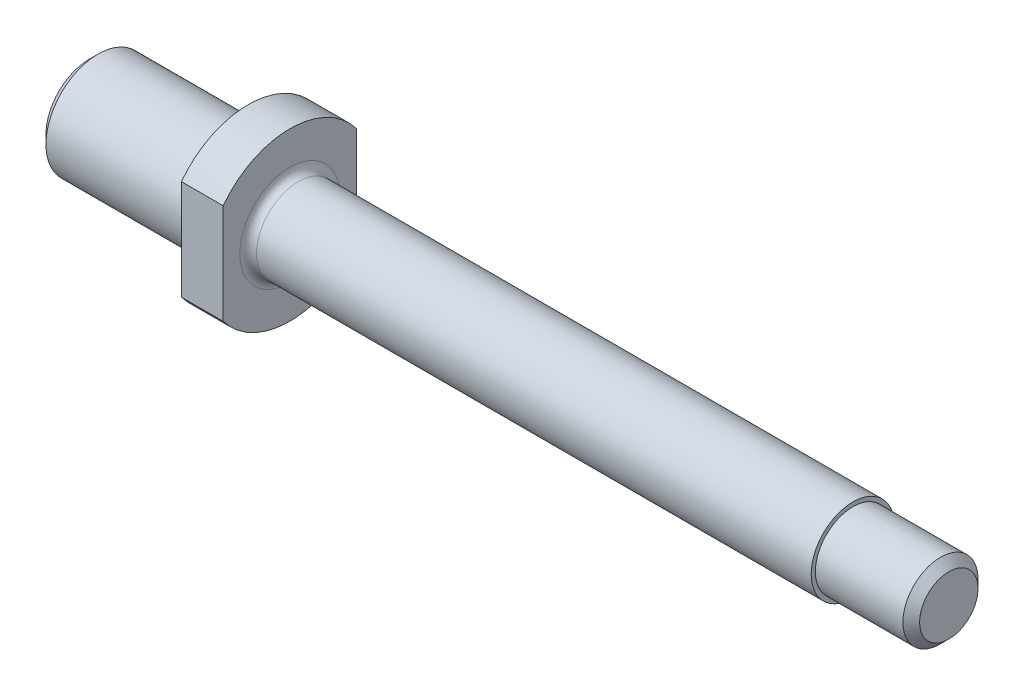
ISO-10303-21;
HEADER;
FILE_DESCRIPTION(('STEP AP214'),'2;1');
FILE_NAME('part.step','',(''),(''),'','','');
FILE_SCHEMA(('AUTOMOTIVE_DESIGN { 1 0 10303 214 1 1 1 1 }'));
ENDSEC;
DATA;
#1=APPLICATION_CONTEXT('core data for automotive mechanical design processes');
#2=APPLICATION_PROTOCOL_DEFINITION('international standard','automotive_design',2000,#1);
#3=PRODUCT_CONTEXT('',#1,'mechanical');
#4=PRODUCT('Part','Part','',(#3));
#5=PRODUCT_RELATED_PRODUCT_CATEGORY('part','',(#4));
#6=PRODUCT_DEFINITION_FORMATION('','',#4);
#7=PRODUCT_DEFINITION_CONTEXT('part definition',#1,'design');
#8=PRODUCT_DEFINITION('design','',#6,#7);
#9=PRODUCT_DEFINITION_SHAPE('','',#8);
#10=(LENGTH_UNIT() NAMED_UNIT(*) SI_UNIT(.MILLI.,.METRE.));
#11=(NAMED_UNIT(*) PLANE_ANGLE_UNIT() SI_UNIT($,.RADIAN.));
#12=(NAMED_UNIT(*) SI_UNIT($,.STERADIAN.) SOLID_ANGLE_UNIT());
#13=UNCERTAINTY_MEASURE_WITH_UNIT(LENGTH_MEASURE(1.E-05),#10,'distance_accuracy_value','');
#14=(GEOMETRIC_REPRESENTATION_CONTEXT(3) GLOBAL_UNCERTAINTY_ASSIGNED_CONTEXT((#13)) GLOBAL_UNIT_ASSIGNED_CONTEXT((#10,
#11,#12)) REPRESENTATION_CONTEXT('',''));
#15=CARTESIAN_POINT('',(0.,0.,0.));
#16=DIRECTION('',(0.,0.,1.));
#17=DIRECTION('',(1.,0.,0.));
#18=AXIS2_PLACEMENT_3D('',#15,#16,#17);
#19=CARTESIAN_POINT('',(0.,0.,0.));
#20=DIRECTION('',(-1.,0.,0.));
#21=DIRECTION('',(0.,0.,1.));
#22=AXIS2_PLACEMENT_3D('',#19,#20,#21);
#23=CYLINDRICAL_SURFACE('',#22,2.);
#24=CARTESIAN_POINT('',(4.8,0.,0.));
#25=DIRECTION('',(-1.,0.,0.));
#26=DIRECTION('',(0.,0.,1.));
#27=AXIS2_PLACEMENT_3D('',#24,#25,#26);
#28=CIRCLE('',#27,2.);
#29=CARTESIAN_POINT('',(4.8,1.2,1.6));
#30=VERTEX_POINT('',#29);
#31=CARTESIAN_POINT('',(4.8,1.2,-1.6));
#32=VERTEX_POINT('',#31);
#33=EDGE_CURVE('E72',#30,#32,#28,.T.);
#34=ORIENTED_EDGE('',*,*,#33,.T.);
#35=DIRECTION('',(1.,0.,0.));
#36=VECTOR('',#35,1.);
#37=CARTESIAN_POINT('',(0.,1.2,-1.6));
#38=LINE('',#37,#36);
#39=CARTESIAN_POINT('',(3.8,1.2,-1.6));
#40=VERTEX_POINT('',#39);
#41=EDGE_CURVE('E31',#40,#32,#38,.T.);
#42=ORIENTED_EDGE('',*,*,#41,.F.);
#43=CARTESIAN_POINT('',(3.8,0.,0.));
#44=DIRECTION('',(-1.,0.,0.));
#45=DIRECTION('',(0.,0.,1.));
#46=AXIS2_PLACEMENT_3D('',#43,#44,#45);
#47=CIRCLE('',#46,2.);
#48=CARTESIAN_POINT('',(3.8,1.2,1.6));
#49=VERTEX_POINT('',#48);
#50=EDGE_CURVE('E80',#49,#40,#47,.T.);
#51=ORIENTED_EDGE('',*,*,#50,.F.);
#52=DIRECTION('',(1.,0.,0.));
#53=VECTOR('',#52,1.);
#54=CARTESIAN_POINT('',(0.,1.2,1.6));
#55=LINE('',#54,#53);
#56=EDGE_CURVE('E173',#49,#30,#55,.T.);
#57=ORIENTED_EDGE('',*,*,#56,.T.);
#58=EDGE_LOOP('',(#34,#42,#51,#57));
#59=FACE_BOUND('',#58,.T.);
#60=ADVANCED_FACE('F16',(#59),#23,.T.);
#61=CARTESIAN_POINT('',(0.,0.,0.));
#62=DIRECTION('',(1.,0.,0.));
#63=DIRECTION('',(0.,0.,-1.));
#64=AXIS2_PLACEMENT_3D('',#61,#62,#63);
#65=PLANE('',#64);
#66=CARTESIAN_POINT('',(0.,0.,0.));
#67=DIRECTION('',(1.,0.,0.));
#68=DIRECTION('',(0.,0.,-1.));
#69=AXIS2_PLACEMENT_3D('',#66,#67,#68);
#70=CIRCLE('',#69,1.05);
#71=CARTESIAN_POINT('',(0.,0.,-1.05));
#72=VERTEX_POINT('',#71);
#73=EDGE_CURVE('E95',#72,#72,#70,.F.);
#74=ORIENTED_EDGE('',*,*,#73,.T.);
#75=EDGE_LOOP('',(#74));
#76=FACE_BOUND('',#75,.T.);
#77=ADVANCED_FACE('F118',(#76),#65,.F.);
#78=CARTESIAN_POINT('',(0.,0.,0.));
#79=DIRECTION('',(-1.,0.,0.));
#80=DIRECTION('',(0.,0.,1.));
#81=AXIS2_PLACEMENT_3D('',#78,#79,#80);
#82=CYLINDRICAL_SURFACE('',#81,1.25);
#83=CARTESIAN_POINT('',(3.6,0.,0.));
#84=DIRECTION('',(1.,0.,0.));
#85=DIRECTION('',(0.,0.,-1.));
#86=AXIS2_PLACEMENT_3D('',#83,#84,#85);
#87=CIRCLE('',#86,1.25);
#88=CARTESIAN_POINT('',(3.6,0.,-1.25));
#89=VERTEX_POINT('',#88);
#90=EDGE_CURVE('E24',#89,#89,#87,.F.);
#91=ORIENTED_EDGE('',*,*,#90,.T.);
#92=EDGE_LOOP('',(#91));
#93=FACE_BOUND('',#92,.T.);
#94=CARTESIAN_POINT('',(0.2,0.,0.));
#95=DIRECTION('',(1.,0.,0.));
#96=DIRECTION('',(0.,0.,-1.));
#97=AXIS2_PLACEMENT_3D('',#94,#95,#96);
#98=CIRCLE('',#97,1.25);
#99=CARTESIAN_POINT('',(0.2,0.,-1.25));
#100=VERTEX_POINT('',#99);
#101=EDGE_CURVE('E98',#100,#100,#98,.T.);
#102=ORIENTED_EDGE('',*,*,#101,.T.);
#103=EDGE_LOOP('',(#102));
#104=FACE_BOUND('',#103,.T.);
#105=ADVANCED_FACE('F103',(#93,#104),#82,.T.);
#106=CARTESIAN_POINT('',(3.8,1.25,0.));
#107=DIRECTION('',(1.,0.,0.));
#108=DIRECTION('',(0.,0.,-1.));
#109=AXIS2_PLACEMENT_3D('',#106,#107,#108);
#110=PLANE('',#109);
#111=CARTESIAN_POINT('',(3.8,0.,0.));
#112=DIRECTION('',(1.,0.,0.));
#113=DIRECTION('',(0.,0.,-1.));
#114=AXIS2_PLACEMENT_3D('',#111,#112,#113);
#115=CIRCLE('',#114,1.45);
#116=CARTESIAN_POINT('',(3.8,0.,-1.45));
#117=VERTEX_POINT('',#116);
#118=EDGE_CURVE('E11',#117,#117,#115,.T.);
#119=ORIENTED_EDGE('',*,*,#118,.T.);
#120=EDGE_LOOP('',(#119));
#121=FACE_BOUND('',#120,.T.);
#122=ORIENTED_EDGE('',*,*,#50,.T.);
#123=DIRECTION('',(0.,-1.,0.));
#124=VECTOR('',#123,1.);
#125=CARTESIAN_POINT('',(3.8,1.25,-1.6));
#126=LINE('',#125,#124);
#127=CARTESIAN_POINT('',(3.8,-1.2,-1.6));
#128=VERTEX_POINT('',#127);
#129=EDGE_CURVE('E67',#40,#128,#126,.T.);
#130=ORIENTED_EDGE('',*,*,#129,.T.);
#131=CARTESIAN_POINT('',(3.8,-1.2,1.6));
#132=VERTEX_POINT('',#131);
#133=EDGE_CURVE('E66',#128,#132,#47,.T.);
#134=ORIENTED_EDGE('',*,*,#133,.T.);
#135=DIRECTION('',(0.,1.,0.));
#136=VECTOR('',#135,1.);
#137=CARTESIAN_POINT('',(3.8,1.25,1.6));
#138=LINE('',#137,#136);
#139=EDGE_CURVE('E171',#132,#49,#138,.T.);
#140=ORIENTED_EDGE('',*,*,#139,.T.);
#141=EDGE_LOOP('',(#122,#130,#134,#140));
#142=FACE_BOUND('',#141,.T.);
#143=ADVANCED_FACE('F130',(#121,#142),#110,.F.);
#144=ORIENTED_EDGE('',*,*,#133,.F.);
#145=DIRECTION('',(1.,0.,0.));
#146=VECTOR('',#145,1.);
#147=CARTESIAN_POINT('',(0.,-1.2,-1.6));
#148=LINE('',#147,#146);
#149=CARTESIAN_POINT('',(4.8,-1.2,-1.6));
#150=VERTEX_POINT('',#149);
#151=EDGE_CURVE('E58',#128,#150,#148,.T.);
#152=ORIENTED_EDGE('',*,*,#151,.T.);
#153=CARTESIAN_POINT('',(4.8,-1.2,1.6));
#154=VERTEX_POINT('',#153);
#155=EDGE_CURVE('E39',#150,#154,#28,.T.);
#156=ORIENTED_EDGE('',*,*,#155,.T.);
#157=DIRECTION('',(1.,0.,0.));
#158=VECTOR('',#157,1.);
#159=CARTESIAN_POINT('',(0.,-1.2,1.6));
#160=LINE('',#159,#158);
#161=EDGE_CURVE('E176',#132,#154,#160,.T.);
#162=ORIENTED_EDGE('',*,*,#161,.F.);
#163=EDGE_LOOP('',(#144,#152,#156,#162));
#164=FACE_BOUND('',#163,.T.);
#165=ADVANCED_FACE('F65',(#164),#23,.T.);
#166=CARTESIAN_POINT('',(4.8,1.,0.));
#167=DIRECTION('',(-1.,0.,0.));
#168=DIRECTION('',(0.,0.,1.));
#169=AXIS2_PLACEMENT_3D('',#166,#167,#168);
#170=PLANE('',#169);
#171=CARTESIAN_POINT('',(4.8,0.,0.));
#172=DIRECTION('',(-1.,0.,0.));
#173=DIRECTION('',(0.,0.,1.));
#174=AXIS2_PLACEMENT_3D('',#171,#172,#173);
#175=CIRCLE('',#174,1.2);
#176=CARTESIAN_POINT('',(4.8,0.,1.2));
#177=VERTEX_POINT('',#176);
#178=EDGE_CURVE('E83',#177,#177,#175,.T.);
#179=ORIENTED_EDGE('',*,*,#178,.T.);
#180=EDGE_LOOP('',(#179));
#181=FACE_BOUND('',#180,.T.);
#182=ORIENTED_EDGE('',*,*,#155,.F.);
#183=DIRECTION('',(0.,-1.,0.));
#184=VECTOR('',#183,1.);
#185=CARTESIAN_POINT('',(4.8,-1.2,-1.6));
#186=LINE('',#185,#184);
#187=EDGE_CURVE('E56',#32,#150,#186,.T.);
#188=ORIENTED_EDGE('',*,*,#187,.F.);
#189=ORIENTED_EDGE('',*,*,#33,.F.);
#190=DIRECTION('',(0.,1.,0.));
#191=VECTOR('',#190,1.);
#192=CARTESIAN_POINT('',(4.8,1.2,1.6));
#193=LINE('',#192,#191);
#194=EDGE_CURVE('E71',#154,#30,#193,.T.);
#195=ORIENTED_EDGE('',*,*,#194,.F.);
#196=EDGE_LOOP('',(#182,#188,#189,#195));
#197=FACE_BOUND('',#196,.T.);
#198=ADVANCED_FACE('F70',(#181,#197),#170,.F.);
#199=CARTESIAN_POINT('',(0.,0.,0.));
#200=DIRECTION('',(-1.,0.,0.));
#201=DIRECTION('',(0.,0.,1.));
#202=AXIS2_PLACEMENT_3D('',#199,#200,#201);
#203=CYLINDRICAL_SURFACE('',#202,1.);
#204=CARTESIAN_POINT('',(5.,0.,0.));
#205=DIRECTION('',(-1.,0.,0.));
#206=DIRECTION('',(0.,0.,1.));
#207=AXIS2_PLACEMENT_3D('',#204,#205,#206);
#208=CIRCLE('',#207,1.);
#209=CARTESIAN_POINT('',(5.,0.,1.));
#210=VERTEX_POINT('',#209);
#211=EDGE_CURVE('E86',#210,#210,#208,.F.);
#212=ORIENTED_EDGE('',*,*,#211,.T.);
#213=EDGE_LOOP('',(#212));
#214=FACE_BOUND('',#213,.T.);
#215=CARTESIAN_POINT('',(18.3,0.,0.));
#216=DIRECTION('',(-1.,0.,0.));
#217=DIRECTION('',(0.,0.,1.));
#218=AXIS2_PLACEMENT_3D('',#215,#216,#217);
#219=CIRCLE('',#218,1.);
#220=CARTESIAN_POINT('',(18.3,0.,1.));
#221=VERTEX_POINT('',#220);
#222=EDGE_CURVE('E73',#221,#221,#219,.T.);
#223=ORIENTED_EDGE('',*,*,#222,.T.);
#224=EDGE_LOOP('',(#223));
#225=FACE_BOUND('',#224,.T.);
#226=ADVANCED_FACE('F136',(#214,#225),#203,.T.);
#227=CARTESIAN_POINT('',(18.3,1.,0.));
#228=DIRECTION('',(-1.,0.,0.));
#229=DIRECTION('',(0.,0.,1.));
#230=AXIS2_PLACEMENT_3D('',#227,#228,#229);
#231=PLANE('',#230);
#232=ORIENTED_EDGE('',*,*,#222,.F.);
#233=EDGE_LOOP('',(#232));
#234=FACE_BOUND('',#233,.T.);
#235=CARTESIAN_POINT('',(18.3,0.,0.));
#236=DIRECTION('',(-1.,0.,0.));
#237=DIRECTION('',(0.,0.,1.));
#238=AXIS2_PLACEMENT_3D('',#235,#236,#237);
#239=CIRCLE('',#238,0.9);
#240=CARTESIAN_POINT('',(18.3,0.,0.9));
#241=VERTEX_POINT('',#240);
#242=EDGE_CURVE('E76',#241,#241,#239,.T.);
#243=ORIENTED_EDGE('',*,*,#242,.T.);
#244=EDGE_LOOP('',(#243));
#245=FACE_BOUND('',#244,.T.);
#246=ADVANCED_FACE('F166',(#234,#245),#231,.F.);
#247=CARTESIAN_POINT('',(0.,0.,0.));
#248=DIRECTION('',(-1.,0.,0.));
#249=DIRECTION('',(0.,0.,1.));
#250=AXIS2_PLACEMENT_3D('',#247,#248,#249);
#251=CYLINDRICAL_SURFACE('',#250,0.9);
#252=CARTESIAN_POINT('',(20.4,0.,0.));
#253=DIRECTION('',(-1.,0.,0.));
#254=DIRECTION('',(0.,0.,1.));
#255=AXIS2_PLACEMENT_3D('',#252,#253,#254);
#256=CIRCLE('',#255,0.9);
#257=CARTESIAN_POINT('',(20.4,0.,0.9));
#258=VERTEX_POINT('',#257);
#259=EDGE_CURVE('E89',#258,#258,#256,.T.);
#260=ORIENTED_EDGE('',*,*,#259,.T.);
#261=EDGE_LOOP('',(#260));
#262=FACE_BOUND('',#261,.T.);
#263=ORIENTED_EDGE('',*,*,#242,.F.);
#264=EDGE_LOOP('',(#263));
#265=FACE_BOUND('',#264,.T.);
#266=ADVANCED_FACE('F163',(#262,#265),#251,.T.);
#267=CARTESIAN_POINT('',(20.6,0.,0.));
#268=DIRECTION('',(-1.,0.,0.));
#269=DIRECTION('',(0.,0.,1.));
#270=AXIS2_PLACEMENT_3D('',#267,#268,#269);
#271=PLANE('',#270);
#272=CARTESIAN_POINT('',(20.6,0.,0.));
#273=DIRECTION('',(-1.,0.,0.));
#274=DIRECTION('',(0.,0.,1.));
#275=AXIS2_PLACEMENT_3D('',#272,#273,#274);
#276=CIRCLE('',#275,0.7);
#277=CARTESIAN_POINT('',(20.6,0.,0.7));
#278=VERTEX_POINT('',#277);
#279=EDGE_CURVE('E92',#278,#278,#276,.F.);
#280=ORIENTED_EDGE('',*,*,#279,.T.);
#281=EDGE_LOOP('',(#280));
#282=FACE_BOUND('',#281,.T.);
#283=ADVANCED_FACE('F150',(#282),#271,.F.);
#284=CARTESIAN_POINT('',(5.,0.,0.));
#285=DIRECTION('',(-1.,0.,0.));
#286=DIRECTION('',(0.,0.,1.));
#287=AXIS2_PLACEMENT_3D('',#284,#285,#286);
#288=TOROIDAL_SURFACE('',#287,1.2,0.2);
#289=ORIENTED_EDGE('',*,*,#211,.F.);
#290=EDGE_LOOP('',(#289));
#291=FACE_BOUND('',#290,.T.);
#292=ORIENTED_EDGE('',*,*,#178,.F.);
#293=EDGE_LOOP('',(#292));
#294=FACE_BOUND('',#293,.T.);
#295=ADVANCED_FACE('F146',(#291,#294),#288,.F.);
#296=CARTESIAN_POINT('',(0.,1.2,1.6));
#297=DIRECTION('',(0.,0.,-1.));
#298=DIRECTION('',(-1.,0.,0.));
#299=AXIS2_PLACEMENT_3D('',#296,#297,#298);
#300=PLANE('',#299);
#301=ORIENTED_EDGE('',*,*,#161,.T.);
#302=ORIENTED_EDGE('',*,*,#194,.T.);
#303=ORIENTED_EDGE('',*,*,#56,.F.);
#304=ORIENTED_EDGE('',*,*,#139,.F.);
#305=EDGE_LOOP('',(#301,#302,#303,#304));
#306=FACE_BOUND('',#305,.T.);
#307=ADVANCED_FACE('F149',(#306),#300,.F.);
#308=CARTESIAN_POINT('',(0.,-1.2,-1.6));
#309=DIRECTION('',(0.,0.,1.));
#310=DIRECTION('',(1.,0.,0.));
#311=AXIS2_PLACEMENT_3D('',#308,#309,#310);
#312=PLANE('',#311);
#313=ORIENTED_EDGE('',*,*,#41,.T.);
#314=ORIENTED_EDGE('',*,*,#187,.T.);
#315=ORIENTED_EDGE('',*,*,#151,.F.);
#316=ORIENTED_EDGE('',*,*,#129,.F.);
#317=EDGE_LOOP('',(#313,#314,#315,#316));
#318=FACE_BOUND('',#317,.T.);
#319=ADVANCED_FACE('F57',(#318),#312,.F.);
#320=CARTESIAN_POINT('',(20.4,0.,0.));
#321=DIRECTION('',(-1.,0.,0.));
#322=DIRECTION('',(0.,0.,1.));
#323=AXIS2_PLACEMENT_3D('',#320,#321,#322);
#324=CONICAL_SURFACE('',#323,0.9,0.785398163397453);
#325=ORIENTED_EDGE('',*,*,#279,.F.);
#326=EDGE_LOOP('',(#325));
#327=FACE_BOUND('',#326,.T.);
#328=ORIENTED_EDGE('',*,*,#259,.F.);
#329=EDGE_LOOP('',(#328));
#330=FACE_BOUND('',#329,.T.);
#331=ADVANCED_FACE('F114',(#327,#330),#324,.T.);
#332=CARTESIAN_POINT('',(0.,0.,0.));
#333=DIRECTION('',(1.,0.,0.));
#334=DIRECTION('',(0.,0.,-1.));
#335=AXIS2_PLACEMENT_3D('',#332,#333,#334);
#336=CONICAL_SURFACE('',#335,1.05,0.785398163397452);
#337=ORIENTED_EDGE('',*,*,#101,.F.);
#338=EDGE_LOOP('',(#337));
#339=FACE_BOUND('',#338,.T.);
#340=ORIENTED_EDGE('',*,*,#73,.F.);
#341=EDGE_LOOP('',(#340));
#342=FACE_BOUND('',#341,.T.);
#343=ADVANCED_FACE('F107',(#339,#342),#336,.T.);
#344=CARTESIAN_POINT('',(3.6,0.,0.));
#345=DIRECTION('',(1.,0.,0.));
#346=DIRECTION('',(0.,0.,-1.));
#347=AXIS2_PLACEMENT_3D('',#344,#345,#346);
#348=TOROIDAL_SURFACE('',#347,1.45,0.2);
#349=ORIENTED_EDGE('',*,*,#118,.F.);
#350=EDGE_LOOP('',(#349));
#351=FACE_BOUND('',#350,.T.);
#352=ORIENTED_EDGE('',*,*,#90,.F.);
#353=EDGE_LOOP('',(#352));
#354=FACE_BOUND('',#353,.T.);
#355=ADVANCED_FACE('F18',(#351,#354),#348,.F.);
#356=CLOSED_SHELL('',(#60,#77,#105,#143,#165,#198,#226,#246,#266,#283,#295,#307,#319,#331,#343,#355));
#357=MANIFOLD_SOLID_BREP('B1',#356);
#358=ADVANCED_BREP_SHAPE_REPRESENTATION('',(#18,#357),#14);
#359=SHAPE_DEFINITION_REPRESENTATION(#9,#358);
ENDSEC;
END-ISO-10303-21;
